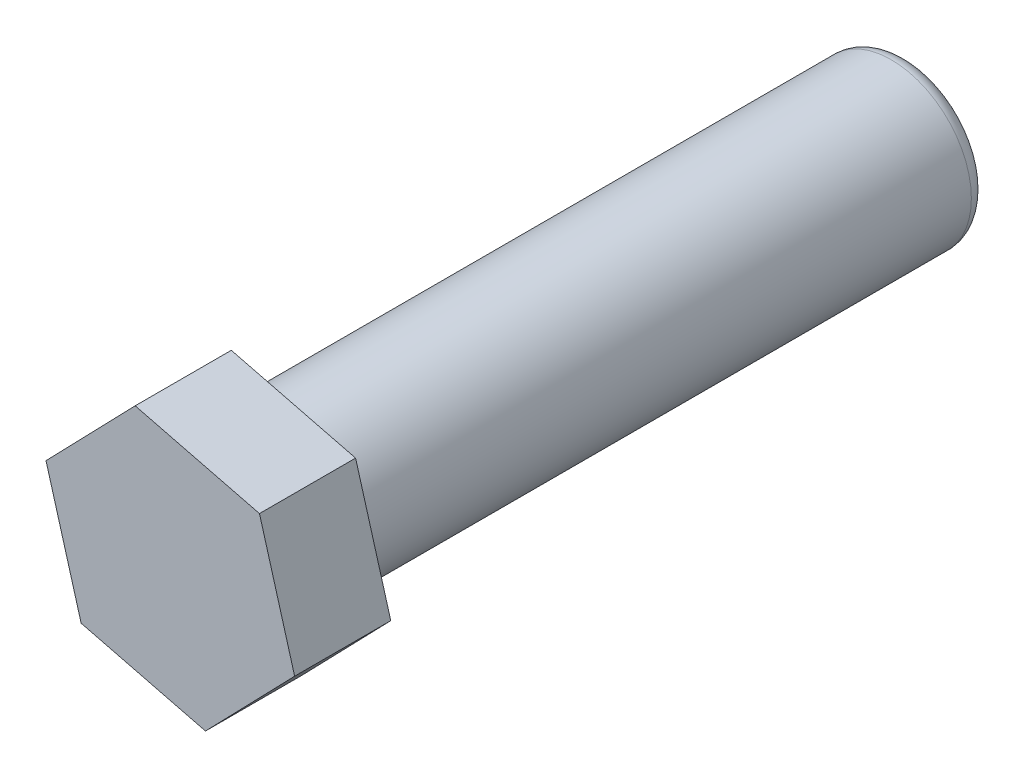
ISO-10303-21;
HEADER;
FILE_DESCRIPTION(('STEP AP214'),'2;1');
FILE_NAME('part.step','',(''),(''),'','','');
FILE_SCHEMA(('AUTOMOTIVE_DESIGN { 1 0 10303 214 1 1 1 1 }'));
ENDSEC;
DATA;
#1=APPLICATION_CONTEXT('core data for automotive mechanical design processes');
#2=APPLICATION_PROTOCOL_DEFINITION('international standard','automotive_design',2000,#1);
#3=PRODUCT_CONTEXT('',#1,'mechanical');
#4=PRODUCT('Part','Part','',(#3));
#5=PRODUCT_RELATED_PRODUCT_CATEGORY('part','',(#4));
#6=PRODUCT_DEFINITION_FORMATION('','',#4);
#7=PRODUCT_DEFINITION_CONTEXT('part definition',#1,'design');
#8=PRODUCT_DEFINITION('design','',#6,#7);
#9=PRODUCT_DEFINITION_SHAPE('','',#8);
#10=(LENGTH_UNIT() NAMED_UNIT(*) SI_UNIT(.MILLI.,.METRE.));
#11=(NAMED_UNIT(*) PLANE_ANGLE_UNIT() SI_UNIT($,.RADIAN.));
#12=(NAMED_UNIT(*) SI_UNIT($,.STERADIAN.) SOLID_ANGLE_UNIT());
#13=UNCERTAINTY_MEASURE_WITH_UNIT(LENGTH_MEASURE(1.E-05),#10,'distance_accuracy_value','');
#14=(GEOMETRIC_REPRESENTATION_CONTEXT(3) GLOBAL_UNCERTAINTY_ASSIGNED_CONTEXT((#13)) GLOBAL_UNIT_ASSIGNED_CONTEXT((#10,
#11,#12)) REPRESENTATION_CONTEXT('',''));
#15=CARTESIAN_POINT('',(0.,0.,0.));
#16=DIRECTION('',(0.,0.,1.));
#17=DIRECTION('',(1.,0.,0.));
#18=AXIS2_PLACEMENT_3D('',#15,#16,#17);
#19=CARTESIAN_POINT('',(0.,0.,20.));
#20=DIRECTION('',(0.,0.,-1.));
#21=DIRECTION('',(-1.,0.,0.));
#22=AXIS2_PLACEMENT_3D('',#19,#20,#21);
#23=CYLINDRICAL_SURFACE('',#22,2.5);
#24=CARTESIAN_POINT('',(0.,0.,0.5));
#25=DIRECTION('',(0.,0.,1.));
#26=DIRECTION('',(1.,0.,0.));
#27=AXIS2_PLACEMENT_3D('',#24,#25,#26);
#28=CIRCLE('',#27,2.5);
#29=CARTESIAN_POINT('',(2.5,0.,0.5));
#30=VERTEX_POINT('',#29);
#31=EDGE_CURVE('E41',#30,#30,#28,.T.);
#32=ORIENTED_EDGE('',*,*,#31,.T.);
#33=EDGE_LOOP('',(#32));
#34=FACE_BOUND('',#33,.T.);
#35=CARTESIAN_POINT('',(0.,0.,20.));
#36=DIRECTION('',(0.,0.,1.));
#37=DIRECTION('',(1.,0.,0.));
#38=AXIS2_PLACEMENT_3D('',#35,#36,#37);
#39=CIRCLE('',#38,2.5);
#40=CARTESIAN_POINT('',(2.5,0.,20.));
#41=VERTEX_POINT('',#40);
#42=EDGE_CURVE('E137',#41,#41,#39,.T.);
#43=ORIENTED_EDGE('',*,*,#42,.F.);
#44=EDGE_LOOP('',(#43));
#45=FACE_BOUND('',#44,.T.);
#46=ADVANCED_FACE('F32',(#34,#45),#23,.T.);
#47=CARTESIAN_POINT('',(0.,0.,0.));
#48=DIRECTION('',(0.,0.,1.));
#49=DIRECTION('',(1.,0.,0.));
#50=AXIS2_PLACEMENT_3D('',#47,#48,#49);
#51=PLANE('',#50);
#52=CARTESIAN_POINT('',(0.,0.,0.));
#53=DIRECTION('',(0.,0.,1.));
#54=DIRECTION('',(1.,0.,0.));
#55=AXIS2_PLACEMENT_3D('',#52,#53,#54);
#56=CIRCLE('',#55,2.);
#57=CARTESIAN_POINT('',(2.,0.,0.));
#58=VERTEX_POINT('',#57);
#59=EDGE_CURVE('E11',#58,#58,#56,.F.);
#60=ORIENTED_EDGE('',*,*,#59,.T.);
#61=EDGE_LOOP('',(#60));
#62=FACE_BOUND('',#61,.T.);
#63=ADVANCED_FACE('F154',(#62),#51,.F.);
#64=CARTESIAN_POINT('',(3.87990037006237,-0.97281710428523,23.));
#65=DIRECTION('',(-0.961625209192317,-0.27436646487104,0.));
#66=DIRECTION('',(0.27436646487104,-0.961625209192318,0.));
#67=AXIS2_PLACEMENT_3D('',#64,#65,#66);
#68=PLANE('',#67);
#69=DIRECTION('',(-0.27436646487104,0.961625209192318,0.));
#70=VECTOR('',#69,1.);
#71=CARTESIAN_POINT('',(3.87990037006237,-0.97281710428523,20.));
#72=LINE('',#71,#70);
#73=CARTESIAN_POINT('',(3.87990037006237,-0.97281710428523,20.));
#74=VERTEX_POINT('',#73);
#75=CARTESIAN_POINT('',(2.78243451057821,2.87368373248404,20.));
#76=VERTEX_POINT('',#75);
#77=EDGE_CURVE('E118',#74,#76,#72,.T.);
#78=ORIENTED_EDGE('',*,*,#77,.T.);
#79=DIRECTION('',(0.,0.,-1.));
#80=VECTOR('',#79,1.);
#81=CARTESIAN_POINT('',(2.78243451057821,2.87368373248404,23.));
#82=LINE('',#81,#80);
#83=CARTESIAN_POINT('',(2.78243451057821,2.87368373248404,23.));
#84=VERTEX_POINT('',#83);
#85=EDGE_CURVE('E135',#84,#76,#82,.T.);
#86=ORIENTED_EDGE('',*,*,#85,.F.);
#87=DIRECTION('',(-0.27436646487104,0.961625209192318,0.));
#88=VECTOR('',#87,1.);
#89=CARTESIAN_POINT('',(3.87990037006237,-0.97281710428523,23.));
#90=LINE('',#89,#88);
#91=CARTESIAN_POINT('',(3.87990037006237,-0.97281710428523,23.));
#92=VERTEX_POINT('',#91);
#93=EDGE_CURVE('E128',#92,#84,#90,.T.);
#94=ORIENTED_EDGE('',*,*,#93,.F.);
#95=DIRECTION('',(0.,0.,-1.));
#96=VECTOR('',#95,1.);
#97=CARTESIAN_POINT('',(3.87990037006237,-0.97281710428523,23.));
#98=LINE('',#97,#96);
#99=EDGE_CURVE('E114',#92,#74,#98,.T.);
#100=ORIENTED_EDGE('',*,*,#99,.T.);
#101=EDGE_LOOP('',(#78,#86,#94,#100));
#102=FACE_BOUND('',#101,.T.);
#103=ADVANCED_FACE('F158',(#102),#68,.F.);
#104=CARTESIAN_POINT('',(2.78243451057821,2.87368373248404,23.));
#105=DIRECTION('',(-0.243204276071308,-0.969975092515592,0.));
#106=DIRECTION('',(0.969975092515592,-0.243204276071308,0.));
#107=AXIS2_PLACEMENT_3D('',#104,#105,#106);
#108=PLANE('',#107);
#109=DIRECTION('',(-0.969975092515592,0.243204276071308,0.));
#110=VECTOR('',#109,1.);
#111=CARTESIAN_POINT('',(2.78243451057821,2.87368373248404,20.));
#112=LINE('',#111,#110);
#113=CARTESIAN_POINT('',(-1.09746585948416,3.84650083676927,20.));
#114=VERTEX_POINT('',#113);
#115=EDGE_CURVE('E121',#76,#114,#112,.T.);
#116=ORIENTED_EDGE('',*,*,#115,.T.);
#117=DIRECTION('',(0.,0.,-1.));
#118=VECTOR('',#117,1.);
#119=CARTESIAN_POINT('',(-1.09746585948416,3.84650083676927,23.));
#120=LINE('',#119,#118);
#121=CARTESIAN_POINT('',(-1.09746585948416,3.84650083676927,23.));
#122=VERTEX_POINT('',#121);
#123=EDGE_CURVE('E132',#122,#114,#120,.T.);
#124=ORIENTED_EDGE('',*,*,#123,.F.);
#125=DIRECTION('',(-0.969975092515592,0.243204276071308,0.));
#126=VECTOR('',#125,1.);
#127=CARTESIAN_POINT('',(2.78243451057821,2.87368373248404,23.));
#128=LINE('',#127,#126);
#129=EDGE_CURVE('E87',#84,#122,#128,.T.);
#130=ORIENTED_EDGE('',*,*,#129,.F.);
#131=ORIENTED_EDGE('',*,*,#85,.T.);
#132=EDGE_LOOP('',(#116,#124,#130,#131));
#133=FACE_BOUND('',#132,.T.);
#134=ADVANCED_FACE('F164',(#133),#108,.F.);
#135=CARTESIAN_POINT('',(-1.09746585948416,3.84650083676927,23.));
#136=DIRECTION('',(0.71842093312101,-0.695608627644552,0.));
#137=DIRECTION('',(0.695608627644552,0.71842093312101,0.));
#138=AXIS2_PLACEMENT_3D('',#135,#136,#137);
#139=PLANE('',#138);
#140=DIRECTION('',(-0.695608627644552,-0.71842093312101,0.));
#141=VECTOR('',#140,1.);
#142=CARTESIAN_POINT('',(-1.09746585948416,3.84650083676927,20.));
#143=LINE('',#142,#141);
#144=CARTESIAN_POINT('',(-3.87990037006237,0.97281710428523,20.));
#145=VERTEX_POINT('',#144);
#146=EDGE_CURVE('E123',#114,#145,#143,.T.);
#147=ORIENTED_EDGE('',*,*,#146,.T.);
#148=DIRECTION('',(0.,0.,-1.));
#149=VECTOR('',#148,1.);
#150=CARTESIAN_POINT('',(-3.87990037006237,0.97281710428523,23.));
#151=LINE('',#150,#149);
#152=CARTESIAN_POINT('',(-3.87990037006237,0.97281710428523,23.));
#153=VERTEX_POINT('',#152);
#154=EDGE_CURVE('E109',#153,#145,#151,.T.);
#155=ORIENTED_EDGE('',*,*,#154,.F.);
#156=DIRECTION('',(-0.695608627644552,-0.71842093312101,0.));
#157=VECTOR('',#156,1.);
#158=CARTESIAN_POINT('',(-1.09746585948416,3.84650083676927,23.));
#159=LINE('',#158,#157);
#160=EDGE_CURVE('E100',#122,#153,#159,.T.);
#161=ORIENTED_EDGE('',*,*,#160,.F.);
#162=ORIENTED_EDGE('',*,*,#123,.T.);
#163=EDGE_LOOP('',(#147,#155,#161,#162));
#164=FACE_BOUND('',#163,.T.);
#165=ADVANCED_FACE('F168',(#164),#139,.F.);
#166=CARTESIAN_POINT('',(-3.87990037006237,0.97281710428523,23.));
#167=DIRECTION('',(0.961625209192318,0.27436646487104,0.));
#168=DIRECTION('',(-0.27436646487104,0.961625209192318,0.));
#169=AXIS2_PLACEMENT_3D('',#166,#167,#168);
#170=PLANE('',#169);
#171=DIRECTION('',(0.27436646487104,-0.961625209192318,0.));
#172=VECTOR('',#171,1.);
#173=CARTESIAN_POINT('',(-3.87990037006237,0.97281710428523,20.));
#174=LINE('',#173,#172);
#175=CARTESIAN_POINT('',(-2.78243451057821,-2.87368373248404,20.));
#176=VERTEX_POINT('',#175);
#177=EDGE_CURVE('E108',#145,#176,#174,.T.);
#178=ORIENTED_EDGE('',*,*,#177,.T.);
#179=DIRECTION('',(0.,0.,-1.));
#180=VECTOR('',#179,1.);
#181=CARTESIAN_POINT('',(-2.78243451057821,-2.87368373248404,23.));
#182=LINE('',#181,#180);
#183=CARTESIAN_POINT('',(-2.78243451057821,-2.87368373248404,23.));
#184=VERTEX_POINT('',#183);
#185=EDGE_CURVE('E105',#184,#176,#182,.T.);
#186=ORIENTED_EDGE('',*,*,#185,.F.);
#187=DIRECTION('',(0.27436646487104,-0.961625209192318,0.));
#188=VECTOR('',#187,1.);
#189=CARTESIAN_POINT('',(-3.87990037006237,0.97281710428523,23.));
#190=LINE('',#189,#188);
#191=EDGE_CURVE('E94',#153,#184,#190,.T.);
#192=ORIENTED_EDGE('',*,*,#191,.F.);
#193=ORIENTED_EDGE('',*,*,#154,.T.);
#194=EDGE_LOOP('',(#178,#186,#192,#193));
#195=FACE_BOUND('',#194,.T.);
#196=ADVANCED_FACE('F106',(#195),#170,.F.);
#197=CARTESIAN_POINT('',(-2.78243451057821,-2.87368373248404,23.));
#198=DIRECTION('',(0.243204276071308,0.969975092515592,0.));
#199=DIRECTION('',(-0.969975092515592,0.243204276071308,0.));
#200=AXIS2_PLACEMENT_3D('',#197,#198,#199);
#201=PLANE('',#200);
#202=DIRECTION('',(0.969975092515592,-0.243204276071308,0.));
#203=VECTOR('',#202,1.);
#204=CARTESIAN_POINT('',(-2.78243451057821,-2.87368373248404,20.));
#205=LINE('',#204,#203);
#206=CARTESIAN_POINT('',(1.09746585948416,-3.84650083676927,20.));
#207=VERTEX_POINT('',#206);
#208=EDGE_CURVE('E72',#176,#207,#205,.T.);
#209=ORIENTED_EDGE('',*,*,#208,.T.);
#210=DIRECTION('',(0.,0.,-1.));
#211=VECTOR('',#210,1.);
#212=CARTESIAN_POINT('',(1.09746585948416,-3.84650083676927,23.));
#213=LINE('',#212,#211);
#214=CARTESIAN_POINT('',(1.09746585948416,-3.84650083676927,23.));
#215=VERTEX_POINT('',#214);
#216=EDGE_CURVE('E110',#215,#207,#213,.T.);
#217=ORIENTED_EDGE('',*,*,#216,.F.);
#218=DIRECTION('',(0.969975092515592,-0.243204276071308,0.));
#219=VECTOR('',#218,1.);
#220=CARTESIAN_POINT('',(-2.78243451057821,-2.87368373248404,23.));
#221=LINE('',#220,#219);
#222=EDGE_CURVE('E98',#184,#215,#221,.T.);
#223=ORIENTED_EDGE('',*,*,#222,.F.);
#224=ORIENTED_EDGE('',*,*,#185,.T.);
#225=EDGE_LOOP('',(#209,#217,#223,#224));
#226=FACE_BOUND('',#225,.T.);
#227=ADVANCED_FACE('F112',(#226),#201,.F.);
#228=CARTESIAN_POINT('',(1.09746585948416,-3.84650083676927,23.));
#229=DIRECTION('',(-0.71842093312101,0.695608627644552,0.));
#230=DIRECTION('',(-0.695608627644552,-0.71842093312101,0.));
#231=AXIS2_PLACEMENT_3D('',#228,#229,#230);
#232=PLANE('',#231);
#233=DIRECTION('',(0.695608627644552,0.71842093312101,0.));
#234=VECTOR('',#233,1.);
#235=CARTESIAN_POINT('',(1.09746585948416,-3.84650083676927,20.));
#236=LINE('',#235,#234);
#237=EDGE_CURVE('E78',#207,#74,#236,.T.);
#238=ORIENTED_EDGE('',*,*,#237,.T.);
#239=ORIENTED_EDGE('',*,*,#99,.F.);
#240=DIRECTION('',(0.695608627644552,0.71842093312101,0.));
#241=VECTOR('',#240,1.);
#242=CARTESIAN_POINT('',(1.09746585948416,-3.84650083676927,23.));
#243=LINE('',#242,#241);
#244=EDGE_CURVE('E49',#215,#92,#243,.T.);
#245=ORIENTED_EDGE('',*,*,#244,.F.);
#246=ORIENTED_EDGE('',*,*,#216,.T.);
#247=EDGE_LOOP('',(#238,#239,#245,#246));
#248=FACE_BOUND('',#247,.T.);
#249=ADVANCED_FACE('F176',(#248),#232,.F.);
#250=CARTESIAN_POINT('',(0.,0.,23.));
#251=DIRECTION('',(0.,0.,1.));
#252=DIRECTION('',(1.,0.,0.));
#253=AXIS2_PLACEMENT_3D('',#250,#251,#252);
#254=PLANE('',#253);
#255=ORIENTED_EDGE('',*,*,#93,.T.);
#256=ORIENTED_EDGE('',*,*,#129,.T.);
#257=ORIENTED_EDGE('',*,*,#160,.T.);
#258=ORIENTED_EDGE('',*,*,#191,.T.);
#259=ORIENTED_EDGE('',*,*,#222,.T.);
#260=ORIENTED_EDGE('',*,*,#244,.T.);
#261=EDGE_LOOP('',(#255,#256,#257,#258,#259,#260));
#262=FACE_BOUND('',#261,.T.);
#263=ADVANCED_FACE('F96',(#262),#254,.T.);
#264=CARTESIAN_POINT('',(0.,0.,20.));
#265=DIRECTION('',(0.,0.,1.));
#266=DIRECTION('',(1.,0.,0.));
#267=AXIS2_PLACEMENT_3D('',#264,#265,#266);
#268=PLANE('',#267);
#269=ORIENTED_EDGE('',*,*,#42,.T.);
#270=EDGE_LOOP('',(#269));
#271=FACE_BOUND('',#270,.T.);
#272=ORIENTED_EDGE('',*,*,#77,.F.);
#273=ORIENTED_EDGE('',*,*,#237,.F.);
#274=ORIENTED_EDGE('',*,*,#208,.F.);
#275=ORIENTED_EDGE('',*,*,#177,.F.);
#276=ORIENTED_EDGE('',*,*,#146,.F.);
#277=ORIENTED_EDGE('',*,*,#115,.F.);
#278=EDGE_LOOP('',(#272,#273,#274,#275,#276,#277));
#279=FACE_BOUND('',#278,.T.);
#280=ADVANCED_FACE('F145',(#271,#279),#268,.F.);
#281=CARTESIAN_POINT('',(0.,0.,0.5));
#282=DIRECTION('',(0.,0.,1.));
#283=DIRECTION('',(1.,0.,0.));
#284=AXIS2_PLACEMENT_3D('',#281,#282,#283);
#285=TOROIDAL_SURFACE('',#284,2.,0.5);
#286=ORIENTED_EDGE('',*,*,#59,.F.);
#287=EDGE_LOOP('',(#286));
#288=FACE_BOUND('',#287,.T.);
#289=ORIENTED_EDGE('',*,*,#31,.F.);
#290=EDGE_LOOP('',(#289));
#291=FACE_BOUND('',#290,.T.);
#292=ADVANCED_FACE('F34',(#288,#291),#285,.T.);
#293=CLOSED_SHELL('',(#46,#63,#103,#134,#165,#196,#227,#249,#263,#280,#292));
#294=MANIFOLD_SOLID_BREP('B2',#293);
#295=ADVANCED_BREP_SHAPE_REPRESENTATION('',(#18,#294),#14);
#296=SHAPE_DEFINITION_REPRESENTATION(#9,#295);
ENDSEC;
END-ISO-10303-21;
